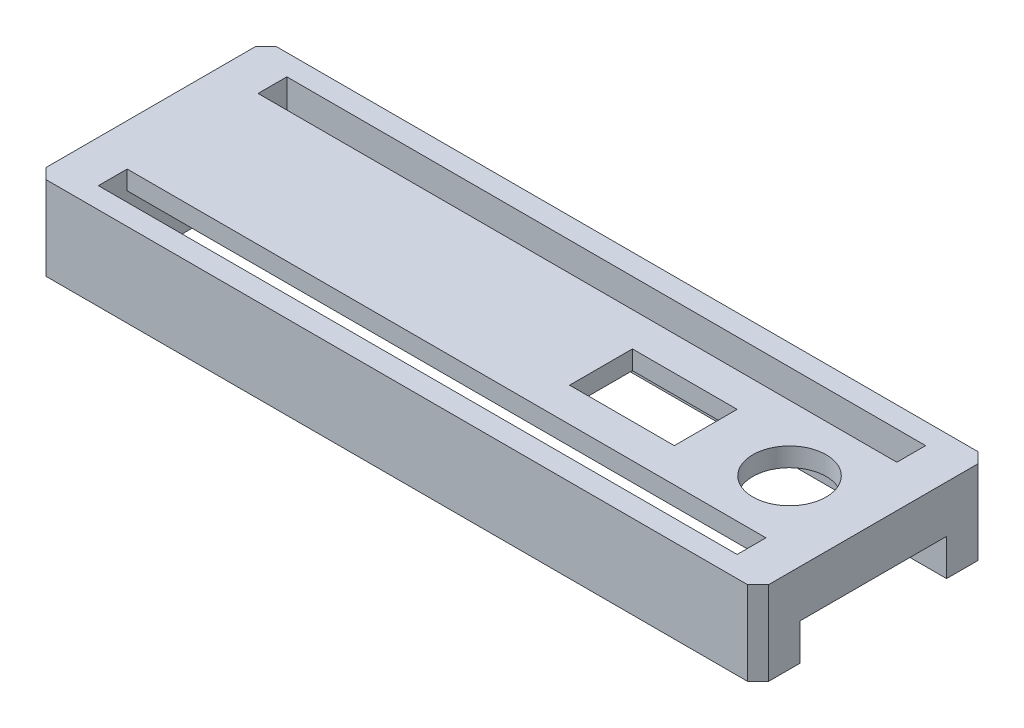
ISO-10303-21;
HEADER;
FILE_DESCRIPTION(('STEP AP214'),'2;1');
FILE_NAME('part.step','',(''),(''),'','','');
FILE_SCHEMA(('AUTOMOTIVE_DESIGN { 1 0 10303 214 1 1 1 1 }'));
ENDSEC;
DATA;
#1=APPLICATION_CONTEXT('core data for automotive mechanical design processes');
#2=APPLICATION_PROTOCOL_DEFINITION('international standard','automotive_design',2000,#1);
#3=PRODUCT_CONTEXT('',#1,'mechanical');
#4=PRODUCT('Part','Part','',(#3));
#5=PRODUCT_RELATED_PRODUCT_CATEGORY('part','',(#4));
#6=PRODUCT_DEFINITION_FORMATION('','',#4);
#7=PRODUCT_DEFINITION_CONTEXT('part definition',#1,'design');
#8=PRODUCT_DEFINITION('design','',#6,#7);
#9=PRODUCT_DEFINITION_SHAPE('','',#8);
#10=(LENGTH_UNIT() NAMED_UNIT(*) SI_UNIT(.MILLI.,.METRE.));
#11=(NAMED_UNIT(*) PLANE_ANGLE_UNIT() SI_UNIT($,.RADIAN.));
#12=(NAMED_UNIT(*) SI_UNIT($,.STERADIAN.) SOLID_ANGLE_UNIT());
#13=UNCERTAINTY_MEASURE_WITH_UNIT(LENGTH_MEASURE(1.E-05),#10,'distance_accuracy_value','');
#14=(GEOMETRIC_REPRESENTATION_CONTEXT(3) GLOBAL_UNCERTAINTY_ASSIGNED_CONTEXT((#13)) GLOBAL_UNIT_ASSIGNED_CONTEXT((#10,
#11,#12)) REPRESENTATION_CONTEXT('',''));
#15=CARTESIAN_POINT('',(0.,0.,0.));
#16=DIRECTION('',(0.,0.,1.));
#17=DIRECTION('',(1.,0.,0.));
#18=AXIS2_PLACEMENT_3D('',#15,#16,#17);
#19=CARTESIAN_POINT('',(0.,0.,0.));
#20=DIRECTION('',(0.,1.,0.));
#21=DIRECTION('',(0.,0.,1.));
#22=AXIS2_PLACEMENT_3D('',#19,#20,#21);
#23=PLANE('',#22);
#24=DIRECTION('',(-1.,0.,0.));
#25=VECTOR('',#24,1.);
#26=CARTESIAN_POINT('',(8.00000000000001,0.,-3.));
#27=LINE('',#26,#25);
#28=CARTESIAN_POINT('',(18.,0.,-3.));
#29=VERTEX_POINT('',#28);
#30=CARTESIAN_POINT('',(8.00000000000001,0.,-3.));
#31=VERTEX_POINT('',#30);
#32=EDGE_CURVE('E371',#29,#31,#27,.T.);
#33=ORIENTED_EDGE('',*,*,#32,.F.);
#34=DIRECTION('',(0.,0.,1.));
#35=VECTOR('',#34,1.);
#36=CARTESIAN_POINT('',(18.,0.,-3.));
#37=LINE('',#36,#35);
#38=CARTESIAN_POINT('',(18.,0.,-9.));
#39=VERTEX_POINT('',#38);
#40=EDGE_CURVE('E375',#39,#29,#37,.T.);
#41=ORIENTED_EDGE('',*,*,#40,.F.);
#42=DIRECTION('',(1.,0.,0.));
#43=VECTOR('',#42,1.);
#44=CARTESIAN_POINT('',(8.00000000000001,0.,-9.));
#45=LINE('',#44,#43);
#46=CARTESIAN_POINT('',(8.00000000000001,0.,-9.));
#47=VERTEX_POINT('',#46);
#48=EDGE_CURVE('E378',#47,#39,#45,.T.);
#49=ORIENTED_EDGE('',*,*,#48,.F.);
#50=DIRECTION('',(0.,0.,-1.));
#51=VECTOR('',#50,1.);
#52=CARTESIAN_POINT('',(8.00000000000001,0.,-3.));
#53=LINE('',#52,#51);
#54=EDGE_CURVE('E367',#31,#47,#53,.T.);
#55=ORIENTED_EDGE('',*,*,#54,.F.);
#56=EDGE_LOOP('',(#33,#41,#49,#55));
#57=FACE_BOUND('',#56,.T.);
#58=CARTESIAN_POINT('',(26.,0.,-6.));
#59=DIRECTION('',(0.,1.,0.));
#60=DIRECTION('',(0.,0.,1.));
#61=AXIS2_PLACEMENT_3D('',#58,#59,#60);
#62=CIRCLE('',#61,3.5);
#63=CARTESIAN_POINT('',(26.,0.,-2.5));
#64=VERTEX_POINT('',#63);
#65=EDGE_CURVE('E411',#64,#64,#62,.F.);
#66=ORIENTED_EDGE('',*,*,#65,.F.);
#67=EDGE_LOOP('',(#66));
#68=FACE_BOUND('',#67,.T.);
#69=DIRECTION('',(0.,0.,-1.));
#70=VECTOR('',#69,1.);
#71=CARTESIAN_POINT('',(30.,0.,0.));
#72=LINE('',#71,#70);
#73=CARTESIAN_POINT('',(30.,0.,0.25));
#74=VERTEX_POINT('',#73);
#75=CARTESIAN_POINT('',(30.,0.,-12.25));
#76=VERTEX_POINT('',#75);
#77=EDGE_CURVE('E298',#74,#76,#72,.T.);
#78=ORIENTED_EDGE('',*,*,#77,.F.);
#79=DIRECTION('',(-1.,0.,0.));
#80=VECTOR('',#79,1.);
#81=CARTESIAN_POINT('',(30.,0.,0.25));
#82=LINE('',#81,#80);
#83=CARTESIAN_POINT('',(-31.,0.,0.250000000000007));
#84=VERTEX_POINT('',#83);
#85=EDGE_CURVE('E444',#74,#84,#82,.T.);
#86=ORIENTED_EDGE('',*,*,#85,.T.);
#87=DIRECTION('',(0.,0.,-1.));
#88=VECTOR('',#87,1.);
#89=CARTESIAN_POINT('',(-31.,0.,0.));
#90=LINE('',#89,#88);
#91=CARTESIAN_POINT('',(-31.,0.,-12.25));
#92=VERTEX_POINT('',#91);
#93=EDGE_CURVE('E295',#84,#92,#90,.T.);
#94=ORIENTED_EDGE('',*,*,#93,.T.);
#95=DIRECTION('',(1.,0.,0.));
#96=VECTOR('',#95,1.);
#97=CARTESIAN_POINT('',(-31.,0.,-12.25));
#98=LINE('',#97,#96);
#99=EDGE_CURVE('E246',#92,#76,#98,.T.);
#100=ORIENTED_EDGE('',*,*,#99,.T.);
#101=EDGE_LOOP('',(#78,#86,#94,#100));
#102=FACE_BOUND('',#101,.T.);
#103=ADVANCED_FACE('F46',(#57,#68,#102),#23,.F.);
#104=CARTESIAN_POINT('',(-35.,1.8,-12.));
#105=DIRECTION('',(1.,0.,0.));
#106=DIRECTION('',(0.,0.,-1.));
#107=AXIS2_PLACEMENT_3D('',#104,#105,#106);
#108=PLANE('',#107);
#109=DIRECTION('',(0.,0.,1.));
#110=VECTOR('',#109,1.);
#111=CARTESIAN_POINT('',(-35.,1.8,-12.));
#112=LINE('',#111,#110);
#113=CARTESIAN_POINT('',(-35.,1.8,-16.));
#114=VERTEX_POINT('',#113);
#115=CARTESIAN_POINT('',(-35.,1.8,4.00000000000001));
#116=VERTEX_POINT('',#115);
#117=EDGE_CURVE('E288',#114,#116,#112,.T.);
#118=ORIENTED_EDGE('',*,*,#117,.F.);
#119=DIRECTION('',(0.,-1.,0.));
#120=VECTOR('',#119,1.);
#121=CARTESIAN_POINT('',(-35.,-6.2,-16.));
#122=LINE('',#121,#120);
#123=CARTESIAN_POINT('',(-35.,-6.2,-16.));
#124=VERTEX_POINT('',#123);
#125=EDGE_CURVE('E324',#114,#124,#122,.T.);
#126=ORIENTED_EDGE('',*,*,#125,.T.);
#127=DIRECTION('',(0.,0.,1.));
#128=VECTOR('',#127,1.);
#129=CARTESIAN_POINT('',(-35.,-6.2,-15.));
#130=LINE('',#129,#128);
#131=CARTESIAN_POINT('',(-35.,-6.2,4.00000000000001));
#132=VERTEX_POINT('',#131);
#133=EDGE_CURVE('E272',#124,#132,#130,.T.);
#134=ORIENTED_EDGE('',*,*,#133,.T.);
#135=DIRECTION('',(0.,1.,0.));
#136=VECTOR('',#135,1.);
#137=CARTESIAN_POINT('',(-35.,1.8,4.00000000000001));
#138=LINE('',#137,#136);
#139=EDGE_CURVE('E320',#132,#116,#138,.T.);
#140=ORIENTED_EDGE('',*,*,#139,.T.);
#141=EDGE_LOOP('',(#118,#126,#134,#140));
#142=FACE_BOUND('',#141,.T.);
#143=ADVANCED_FACE('F495',(#142),#108,.F.);
#144=CARTESIAN_POINT('',(0.,1.8,0.));
#145=DIRECTION('',(0.,1.,0.));
#146=DIRECTION('',(0.,0.,1.));
#147=AXIS2_PLACEMENT_3D('',#144,#145,#146);
#148=PLANE('',#147);
#149=DIRECTION('',(-1.,0.,0.));
#150=VECTOR('',#149,1.);
#151=CARTESIAN_POINT('',(35.,1.8,-17.));
#152=LINE('',#151,#150);
#153=CARTESIAN_POINT('',(33.,1.8,-17.));
#154=VERTEX_POINT('',#153);
#155=CARTESIAN_POINT('',(-34.,1.8,-17.));
#156=VERTEX_POINT('',#155);
#157=EDGE_CURVE('E434',#154,#156,#152,.T.);
#158=ORIENTED_EDGE('',*,*,#157,.T.);
#159=DIRECTION('',(-0.707106781186545,0.,0.70710678118655));
#160=VECTOR('',#159,1.);
#161=CARTESIAN_POINT('',(-25.5000000000001,1.8,-25.4999999999999));
#162=LINE('',#161,#160);
#163=EDGE_CURVE('E317',#156,#114,#162,.T.);
#164=ORIENTED_EDGE('',*,*,#163,.T.);
#165=ORIENTED_EDGE('',*,*,#117,.T.);
#166=DIRECTION('',(0.70710678118655,0.,0.707106781186545));
#167=VECTOR('',#166,1.);
#168=CARTESIAN_POINT('',(-19.4999999999999,1.8,19.5));
#169=LINE('',#168,#167);
#170=CARTESIAN_POINT('',(-34.,1.8,5.00000000000001));
#171=VERTEX_POINT('',#170);
#172=EDGE_CURVE('E314',#116,#171,#169,.T.);
#173=ORIENTED_EDGE('',*,*,#172,.T.);
#174=DIRECTION('',(1.,0.,0.));
#175=VECTOR('',#174,1.);
#176=CARTESIAN_POINT('',(35.,1.8,5.));
#177=LINE('',#176,#175);
#178=CARTESIAN_POINT('',(33.,1.8,5.));
#179=VERTEX_POINT('',#178);
#180=EDGE_CURVE('E423',#171,#179,#177,.T.);
#181=ORIENTED_EDGE('',*,*,#180,.T.);
#182=DIRECTION('',(0.707106781186542,0.,-0.707106781186553));
#183=VECTOR('',#182,1.);
#184=CARTESIAN_POINT('',(19.0000000000003,1.8,19.));
#185=LINE('',#184,#183);
#186=CARTESIAN_POINT('',(34.,1.8,4.));
#187=VERTEX_POINT('',#186);
#188=EDGE_CURVE('E311',#179,#187,#185,.T.);
#189=ORIENTED_EDGE('',*,*,#188,.T.);
#190=DIRECTION('',(0.,0.,1.));
#191=VECTOR('',#190,1.);
#192=CARTESIAN_POINT('',(34.,1.8,-17.));
#193=LINE('',#192,#191);
#194=CARTESIAN_POINT('',(34.,1.8,-16.));
#195=VERTEX_POINT('',#194);
#196=EDGE_CURVE('E348',#195,#187,#193,.T.);
#197=ORIENTED_EDGE('',*,*,#196,.F.);
#198=DIRECTION('',(-0.707106781186548,0.,-0.707106781186548));
#199=VECTOR('',#198,1.);
#200=CARTESIAN_POINT('',(25.,1.8,-25.));
#201=LINE('',#200,#199);
#202=EDGE_CURVE('E308',#195,#154,#201,.T.);
#203=ORIENTED_EDGE('',*,*,#202,.T.);
#204=EDGE_LOOP('',(#158,#164,#165,#173,#181,#189,#197,#203));
#205=FACE_BOUND('',#204,.T.);
#206=DIRECTION('',(0.,0.,-1.));
#207=VECTOR('',#206,1.);
#208=CARTESIAN_POINT('',(18.,1.8,-3.));
#209=LINE('',#208,#207);
#210=CARTESIAN_POINT('',(18.,1.8,-3.));
#211=VERTEX_POINT('',#210);
#212=CARTESIAN_POINT('',(18.,1.8,-9.));
#213=VERTEX_POINT('',#212);
#214=EDGE_CURVE('E228',#211,#213,#209,.T.);
#215=ORIENTED_EDGE('',*,*,#214,.F.);
#216=DIRECTION('',(1.,0.,0.));
#217=VECTOR('',#216,1.);
#218=CARTESIAN_POINT('',(8.00000000000001,1.8,-3.));
#219=LINE('',#218,#217);
#220=CARTESIAN_POINT('',(8.00000000000001,1.8,-3.));
#221=VERTEX_POINT('',#220);
#222=EDGE_CURVE('E389',#221,#211,#219,.T.);
#223=ORIENTED_EDGE('',*,*,#222,.F.);
#224=DIRECTION('',(0.,0.,1.));
#225=VECTOR('',#224,1.);
#226=CARTESIAN_POINT('',(8.00000000000001,1.8,-3.));
#227=LINE('',#226,#225);
#228=CARTESIAN_POINT('',(8.00000000000001,1.8,-9.));
#229=VERTEX_POINT('',#228);
#230=EDGE_CURVE('E385',#229,#221,#227,.T.);
#231=ORIENTED_EDGE('',*,*,#230,.F.);
#232=DIRECTION('',(-1.,0.,0.));
#233=VECTOR('',#232,1.);
#234=CARTESIAN_POINT('',(8.00000000000001,1.8,-9.));
#235=LINE('',#234,#233);
#236=EDGE_CURVE('E381',#213,#229,#235,.T.);
#237=ORIENTED_EDGE('',*,*,#236,.F.);
#238=EDGE_LOOP('',(#215,#223,#231,#237));
#239=FACE_BOUND('',#238,.T.);
#240=CARTESIAN_POINT('',(26.,1.8,-6.));
#241=DIRECTION('',(0.,1.,0.));
#242=DIRECTION('',(0.,0.,1.));
#243=AXIS2_PLACEMENT_3D('',#240,#241,#242);
#244=CIRCLE('',#243,3.5);
#245=CARTESIAN_POINT('',(26.,1.8,-2.5));
#246=VERTEX_POINT('',#245);
#247=EDGE_CURVE('E407',#246,#246,#244,.T.);
#248=ORIENTED_EDGE('',*,*,#247,.F.);
#249=EDGE_LOOP('',(#248));
#250=FACE_BOUND('',#249,.T.);
#251=DIRECTION('',(-1.,0.,0.));
#252=VECTOR('',#251,1.);
#253=CARTESIAN_POINT('',(-35.,1.8,3.));
#254=LINE('',#253,#252);
#255=CARTESIAN_POINT('',(30.,1.8,3.));
#256=VERTEX_POINT('',#255);
#257=CARTESIAN_POINT('',(-31.,1.8,3.));
#258=VERTEX_POINT('',#257);
#259=EDGE_CURVE('E419',#256,#258,#254,.T.);
#260=ORIENTED_EDGE('',*,*,#259,.T.);
#261=DIRECTION('',(0.,0.,-1.));
#262=VECTOR('',#261,1.);
#263=CARTESIAN_POINT('',(-31.,1.8,3.));
#264=LINE('',#263,#262);
#265=CARTESIAN_POINT('',(-31.,1.8,0.250000000000008));
#266=VERTEX_POINT('',#265);
#267=EDGE_CURVE('E277',#258,#266,#264,.T.);
#268=ORIENTED_EDGE('',*,*,#267,.T.);
#269=DIRECTION('',(1.,0.,0.));
#270=VECTOR('',#269,1.);
#271=CARTESIAN_POINT('',(30.,1.8,0.25));
#272=LINE('',#271,#270);
#273=CARTESIAN_POINT('',(30.,1.8,0.250000000000008));
#274=VERTEX_POINT('',#273);
#275=EDGE_CURVE('E455',#266,#274,#272,.T.);
#276=ORIENTED_EDGE('',*,*,#275,.T.);
#277=DIRECTION('',(0.,0.,-1.));
#278=VECTOR('',#277,1.);
#279=CARTESIAN_POINT('',(30.,1.8,3.));
#280=LINE('',#279,#278);
#281=EDGE_CURVE('E257',#256,#274,#280,.T.);
#282=ORIENTED_EDGE('',*,*,#281,.F.);
#283=EDGE_LOOP('',(#260,#268,#276,#282));
#284=FACE_BOUND('',#283,.T.);
#285=CARTESIAN_POINT('',(-31.,1.8,-12.25));
#286=VERTEX_POINT('',#285);
#287=CARTESIAN_POINT('',(-31.,1.8,-15.));
#288=VERTEX_POINT('',#287);
#289=EDGE_CURVE('E265',#286,#288,#264,.T.);
#290=ORIENTED_EDGE('',*,*,#289,.T.);
#291=DIRECTION('',(1.,0.,0.));
#292=VECTOR('',#291,1.);
#293=CARTESIAN_POINT('',(-35.,1.8,-15.));
#294=LINE('',#293,#292);
#295=CARTESIAN_POINT('',(30.,1.8,-15.));
#296=VERTEX_POINT('',#295);
#297=EDGE_CURVE('E426',#288,#296,#294,.T.);
#298=ORIENTED_EDGE('',*,*,#297,.T.);
#299=CARTESIAN_POINT('',(30.,1.8,-12.25));
#300=VERTEX_POINT('',#299);
#301=EDGE_CURVE('E253',#300,#296,#280,.T.);
#302=ORIENTED_EDGE('',*,*,#301,.F.);
#303=DIRECTION('',(-1.,0.,0.));
#304=VECTOR('',#303,1.);
#305=CARTESIAN_POINT('',(-31.,1.8,-12.25));
#306=LINE('',#305,#304);
#307=EDGE_CURVE('E443',#300,#286,#306,.T.);
#308=ORIENTED_EDGE('',*,*,#307,.T.);
#309=EDGE_LOOP('',(#290,#298,#302,#308));
#310=FACE_BOUND('',#309,.T.);
#311=ADVANCED_FACE('F354',(#205,#239,#250,#284,#310),#148,.T.);
#312=CARTESIAN_POINT('',(-31.,-6.2,3.));
#313=DIRECTION('',(1.,0.,0.));
#314=DIRECTION('',(0.,0.,-1.));
#315=AXIS2_PLACEMENT_3D('',#312,#313,#314);
#316=PLANE('',#315);
#317=DIRECTION('',(0.,1.,0.));
#318=VECTOR('',#317,1.);
#319=CARTESIAN_POINT('',(-31.,-62.2675678021874,-12.25));
#320=LINE('',#319,#318);
#321=EDGE_CURVE('E459',#92,#286,#320,.T.);
#322=ORIENTED_EDGE('',*,*,#321,.F.);
#323=ORIENTED_EDGE('',*,*,#93,.F.);
#324=DIRECTION('',(0.,1.,0.));
#325=VECTOR('',#324,1.);
#326=CARTESIAN_POINT('',(-31.,-62.2675678021874,0.250000000000008));
#327=LINE('',#326,#325);
#328=EDGE_CURVE('E466',#84,#266,#327,.T.);
#329=ORIENTED_EDGE('',*,*,#328,.T.);
#330=ORIENTED_EDGE('',*,*,#267,.F.);
#331=DIRECTION('',(0.,1.,0.));
#332=VECTOR('',#331,1.);
#333=CARTESIAN_POINT('',(-31.,-6.2,3.));
#334=LINE('',#333,#332);
#335=CARTESIAN_POINT('',(-31.,-6.2,3.));
#336=VERTEX_POINT('',#335);
#337=EDGE_CURVE('E280',#336,#258,#334,.T.);
#338=ORIENTED_EDGE('',*,*,#337,.F.);
#339=DIRECTION('',(0.,0.,-1.));
#340=VECTOR('',#339,1.);
#341=CARTESIAN_POINT('',(-31.,-6.2,3.));
#342=LINE('',#341,#340);
#343=CARTESIAN_POINT('',(-31.,-6.2,-15.));
#344=VERTEX_POINT('',#343);
#345=EDGE_CURVE('E276',#336,#344,#342,.T.);
#346=ORIENTED_EDGE('',*,*,#345,.T.);
#347=DIRECTION('',(0.,1.,0.));
#348=VECTOR('',#347,1.);
#349=CARTESIAN_POINT('',(-31.,-6.2,-15.));
#350=LINE('',#349,#348);
#351=EDGE_CURVE('E284',#344,#288,#350,.T.);
#352=ORIENTED_EDGE('',*,*,#351,.T.);
#353=ORIENTED_EDGE('',*,*,#289,.F.);
#354=EDGE_LOOP('',(#322,#323,#329,#330,#338,#346,#352,#353));
#355=FACE_BOUND('',#354,.T.);
#356=ADVANCED_FACE('F592',(#355),#316,.T.);
#357=CARTESIAN_POINT('',(0.,-6.2,0.));
#358=DIRECTION('',(0.,1.,0.));
#359=DIRECTION('',(0.,0.,1.));
#360=AXIS2_PLACEMENT_3D('',#357,#358,#359);
#361=PLANE('',#360);
#362=ORIENTED_EDGE('',*,*,#133,.F.);
#363=DIRECTION('',(0.707106781186545,0.,-0.70710678118655));
#364=VECTOR('',#363,1.);
#365=CARTESIAN_POINT('',(-34.,-6.2,-17.));
#366=LINE('',#365,#364);
#367=CARTESIAN_POINT('',(-34.,-6.2,-17.));
#368=VERTEX_POINT('',#367);
#369=EDGE_CURVE('E335',#124,#368,#366,.T.);
#370=ORIENTED_EDGE('',*,*,#369,.T.);
#371=DIRECTION('',(1.,0.,0.));
#372=VECTOR('',#371,1.);
#373=CARTESIAN_POINT('',(35.,-6.2,-17.));
#374=LINE('',#373,#372);
#375=CARTESIAN_POINT('',(33.,-6.2,-17.));
#376=VERTEX_POINT('',#375);
#377=EDGE_CURVE('E429',#368,#376,#374,.T.);
#378=ORIENTED_EDGE('',*,*,#377,.T.);
#379=DIRECTION('',(0.707106781186548,0.,0.707106781186548));
#380=VECTOR('',#379,1.);
#381=CARTESIAN_POINT('',(34.,-6.2,-16.));
#382=LINE('',#381,#380);
#383=CARTESIAN_POINT('',(34.,-6.2,-16.));
#384=VERTEX_POINT('',#383);
#385=EDGE_CURVE('E327',#376,#384,#382,.T.);
#386=ORIENTED_EDGE('',*,*,#385,.T.);
#387=DIRECTION('',(0.,0.,-1.));
#388=VECTOR('',#387,1.);
#389=CARTESIAN_POINT('',(34.,-6.2,-17.));
#390=LINE('',#389,#388);
#391=CARTESIAN_POINT('',(34.,-6.2,-13.));
#392=VERTEX_POINT('',#391);
#393=EDGE_CURVE('E218',#392,#384,#390,.T.);
#394=ORIENTED_EDGE('',*,*,#393,.F.);
#395=DIRECTION('',(1.,0.,0.));
#396=VECTOR('',#395,1.);
#397=CARTESIAN_POINT('',(35.,-6.2,-13.));
#398=LINE('',#397,#396);
#399=CARTESIAN_POINT('',(30.,-6.2,-13.));
#400=VERTEX_POINT('',#399);
#401=EDGE_CURVE('E238',#400,#392,#398,.T.);
#402=ORIENTED_EDGE('',*,*,#401,.F.);
#403=DIRECTION('',(0.,0.,1.));
#404=VECTOR('',#403,1.);
#405=CARTESIAN_POINT('',(30.,-6.2,3.));
#406=LINE('',#405,#404);
#407=CARTESIAN_POINT('',(30.,-6.2,-15.));
#408=VERTEX_POINT('',#407);
#409=EDGE_CURVE('E261',#408,#400,#406,.T.);
#410=ORIENTED_EDGE('',*,*,#409,.F.);
#411=DIRECTION('',(-1.,0.,0.));
#412=VECTOR('',#411,1.);
#413=CARTESIAN_POINT('',(-35.,-6.2,-15.));
#414=LINE('',#413,#412);
#415=EDGE_CURVE('E433',#408,#344,#414,.T.);
#416=ORIENTED_EDGE('',*,*,#415,.T.);
#417=ORIENTED_EDGE('',*,*,#345,.F.);
#418=DIRECTION('',(1.,0.,0.));
#419=VECTOR('',#418,1.);
#420=CARTESIAN_POINT('',(-35.,-6.2,3.));
#421=LINE('',#420,#419);
#422=CARTESIAN_POINT('',(30.,-6.2,3.));
#423=VERTEX_POINT('',#422);
#424=EDGE_CURVE('E418',#336,#423,#421,.T.);
#425=ORIENTED_EDGE('',*,*,#424,.T.);
#426=CARTESIAN_POINT('',(30.,-6.2,1.));
#427=VERTEX_POINT('',#426);
#428=EDGE_CURVE('E235',#427,#423,#406,.T.);
#429=ORIENTED_EDGE('',*,*,#428,.F.);
#430=DIRECTION('',(-1.,0.,0.));
#431=VECTOR('',#430,1.);
#432=CARTESIAN_POINT('',(30.,-6.2,1.));
#433=LINE('',#432,#431);
#434=CARTESIAN_POINT('',(34.,-6.2,1.));
#435=VERTEX_POINT('',#434);
#436=EDGE_CURVE('E224',#435,#427,#433,.T.);
#437=ORIENTED_EDGE('',*,*,#436,.F.);
#438=CARTESIAN_POINT('',(34.,-6.2,4.));
#439=VERTEX_POINT('',#438);
#440=EDGE_CURVE('E208',#439,#435,#390,.T.);
#441=ORIENTED_EDGE('',*,*,#440,.F.);
#442=DIRECTION('',(-0.707106781186542,0.,0.707106781186553));
#443=VECTOR('',#442,1.);
#444=CARTESIAN_POINT('',(33.,-6.2,5.));
#445=LINE('',#444,#443);
#446=CARTESIAN_POINT('',(33.,-6.2,5.));
#447=VERTEX_POINT('',#446);
#448=EDGE_CURVE('E70',#439,#447,#445,.T.);
#449=ORIENTED_EDGE('',*,*,#448,.T.);
#450=DIRECTION('',(-1.,0.,0.));
#451=VECTOR('',#450,1.);
#452=CARTESIAN_POINT('',(35.,-6.2,5.));
#453=LINE('',#452,#451);
#454=CARTESIAN_POINT('',(-34.,-6.2,5.00000000000001));
#455=VERTEX_POINT('',#454);
#456=EDGE_CURVE('E415',#447,#455,#453,.T.);
#457=ORIENTED_EDGE('',*,*,#456,.T.);
#458=DIRECTION('',(-0.70710678118655,0.,-0.707106781186545));
#459=VECTOR('',#458,1.);
#460=CARTESIAN_POINT('',(-35.,-6.2,4.00000000000001));
#461=LINE('',#460,#459);
#462=EDGE_CURVE('E332',#455,#132,#461,.T.);
#463=ORIENTED_EDGE('',*,*,#462,.T.);
#464=EDGE_LOOP('',(#362,#370,#378,#386,#394,#402,#410,#416,#417,#425,#429,#437,#441,#449,#457,#463));
#465=FACE_BOUND('',#464,.T.);
#466=ADVANCED_FACE('F233',(#465),#361,.F.);
#467=CARTESIAN_POINT('',(30.,-24.8815416922694,3.));
#468=DIRECTION('',(1.,0.,0.));
#469=DIRECTION('',(0.,0.,-1.));
#470=AXIS2_PLACEMENT_3D('',#467,#468,#469);
#471=PLANE('',#470);
#472=ORIENTED_EDGE('',*,*,#77,.T.);
#473=DIRECTION('',(0.,1.,0.));
#474=VECTOR('',#473,1.);
#475=CARTESIAN_POINT('',(30.,-62.2675678021874,-12.25));
#476=LINE('',#475,#474);
#477=EDGE_CURVE('E448',#76,#300,#476,.T.);
#478=ORIENTED_EDGE('',*,*,#477,.T.);
#479=ORIENTED_EDGE('',*,*,#301,.T.);
#480=DIRECTION('',(0.,1.,0.));
#481=VECTOR('',#480,1.);
#482=CARTESIAN_POINT('',(30.,-24.8815416922694,-15.));
#483=LINE('',#482,#481);
#484=EDGE_CURVE('E268',#408,#296,#483,.T.);
#485=ORIENTED_EDGE('',*,*,#484,.F.);
#486=ORIENTED_EDGE('',*,*,#409,.T.);
#487=DIRECTION('',(0.,-1.,0.));
#488=VECTOR('',#487,1.);
#489=CARTESIAN_POINT('',(30.,-2.7,-13.));
#490=LINE('',#489,#488);
#491=CARTESIAN_POINT('',(30.,-2.7,-13.));
#492=VERTEX_POINT('',#491);
#493=EDGE_CURVE('E254',#492,#400,#490,.T.);
#494=ORIENTED_EDGE('',*,*,#493,.F.);
#495=DIRECTION('',(0.,0.,-1.));
#496=VECTOR('',#495,1.);
#497=CARTESIAN_POINT('',(30.,-2.7,-13.));
#498=LINE('',#497,#496);
#499=CARTESIAN_POINT('',(30.,-2.7,1.));
#500=VERTEX_POINT('',#499);
#501=EDGE_CURVE('E237',#500,#492,#498,.T.);
#502=ORIENTED_EDGE('',*,*,#501,.F.);
#503=DIRECTION('',(0.,-1.,0.));
#504=VECTOR('',#503,1.);
#505=CARTESIAN_POINT('',(30.,-2.7,1.));
#506=LINE('',#505,#504);
#507=EDGE_CURVE('E250',#500,#427,#506,.T.);
#508=ORIENTED_EDGE('',*,*,#507,.T.);
#509=ORIENTED_EDGE('',*,*,#428,.T.);
#510=DIRECTION('',(0.,1.,0.));
#511=VECTOR('',#510,1.);
#512=CARTESIAN_POINT('',(30.,-24.8815416922694,3.));
#513=LINE('',#512,#511);
#514=EDGE_CURVE('E260',#423,#256,#513,.T.);
#515=ORIENTED_EDGE('',*,*,#514,.T.);
#516=ORIENTED_EDGE('',*,*,#281,.T.);
#517=DIRECTION('',(0.,1.,0.));
#518=VECTOR('',#517,1.);
#519=CARTESIAN_POINT('',(30.,-62.2675678021874,0.25));
#520=LINE('',#519,#518);
#521=EDGE_CURVE('E462',#74,#274,#520,.T.);
#522=ORIENTED_EDGE('',*,*,#521,.F.);
#523=EDGE_LOOP('',(#472,#478,#479,#485,#486,#494,#502,#508,#509,#515,#516,#522));
#524=FACE_BOUND('',#523,.T.);
#525=ADVANCED_FACE('F480',(#524),#471,.F.);
#526=CARTESIAN_POINT('',(30.,-2.7,1.));
#527=DIRECTION('',(0.,0.,1.));
#528=DIRECTION('',(1.,0.,0.));
#529=AXIS2_PLACEMENT_3D('',#526,#527,#528);
#530=PLANE('',#529);
#531=DIRECTION('',(-1.,0.,0.));
#532=VECTOR('',#531,1.);
#533=CARTESIAN_POINT('',(30.,-2.7,1.));
#534=LINE('',#533,#532);
#535=CARTESIAN_POINT('',(34.,-2.7,1.));
#536=VERTEX_POINT('',#535);
#537=EDGE_CURVE('E226',#536,#500,#534,.T.);
#538=ORIENTED_EDGE('',*,*,#537,.F.);
#539=DIRECTION('',(0.,-1.,0.));
#540=VECTOR('',#539,1.);
#541=CARTESIAN_POINT('',(34.,-2.7,1.));
#542=LINE('',#541,#540);
#543=EDGE_CURVE('E212',#536,#435,#542,.T.);
#544=ORIENTED_EDGE('',*,*,#543,.T.);
#545=ORIENTED_EDGE('',*,*,#436,.T.);
#546=ORIENTED_EDGE('',*,*,#507,.F.);
#547=EDGE_LOOP('',(#538,#544,#545,#546));
#548=FACE_BOUND('',#547,.T.);
#549=ADVANCED_FACE('F222',(#548),#530,.F.);
#550=CARTESIAN_POINT('',(35.,-2.7,-13.));
#551=DIRECTION('',(0.,0.,-1.));
#552=DIRECTION('',(-1.,0.,0.));
#553=AXIS2_PLACEMENT_3D('',#550,#551,#552);
#554=PLANE('',#553);
#555=ORIENTED_EDGE('',*,*,#401,.T.);
#556=DIRECTION('',(0.,1.,0.));
#557=VECTOR('',#556,1.);
#558=CARTESIAN_POINT('',(34.,-2.7,-13.));
#559=LINE('',#558,#557);
#560=CARTESIAN_POINT('',(34.,-2.7,-13.));
#561=VERTEX_POINT('',#560);
#562=EDGE_CURVE('E229',#392,#561,#559,.T.);
#563=ORIENTED_EDGE('',*,*,#562,.T.);
#564=DIRECTION('',(1.,0.,0.));
#565=VECTOR('',#564,1.);
#566=CARTESIAN_POINT('',(35.,-2.7,-13.));
#567=LINE('',#566,#565);
#568=EDGE_CURVE('E243',#492,#561,#567,.T.);
#569=ORIENTED_EDGE('',*,*,#568,.F.);
#570=ORIENTED_EDGE('',*,*,#493,.T.);
#571=EDGE_LOOP('',(#555,#563,#569,#570));
#572=FACE_BOUND('',#571,.T.);
#573=ADVANCED_FACE('F484',(#572),#554,.F.);
#574=CARTESIAN_POINT('',(0.,-2.7,0.));
#575=DIRECTION('',(0.,1.,0.));
#576=DIRECTION('',(0.,0.,1.));
#577=AXIS2_PLACEMENT_3D('',#574,#575,#576);
#578=PLANE('',#577);
#579=ORIENTED_EDGE('',*,*,#568,.T.);
#580=DIRECTION('',(0.,0.,1.));
#581=VECTOR('',#580,1.);
#582=CARTESIAN_POINT('',(34.,-2.7,0.));
#583=LINE('',#582,#581);
#584=EDGE_CURVE('E217',#561,#536,#583,.T.);
#585=ORIENTED_EDGE('',*,*,#584,.T.);
#586=ORIENTED_EDGE('',*,*,#537,.T.);
#587=ORIENTED_EDGE('',*,*,#501,.T.);
#588=EDGE_LOOP('',(#579,#585,#586,#587));
#589=FACE_BOUND('',#588,.T.);
#590=ADVANCED_FACE('F476',(#589),#578,.F.);
#591=CARTESIAN_POINT('',(30.,-62.2675678021874,0.25));
#592=DIRECTION('',(0.,0.,1.));
#593=DIRECTION('',(1.,0.,0.));
#594=AXIS2_PLACEMENT_3D('',#591,#592,#593);
#595=PLANE('',#594);
#596=ORIENTED_EDGE('',*,*,#85,.F.);
#597=ORIENTED_EDGE('',*,*,#521,.T.);
#598=ORIENTED_EDGE('',*,*,#275,.F.);
#599=ORIENTED_EDGE('',*,*,#328,.F.);
#600=EDGE_LOOP('',(#596,#597,#598,#599));
#601=FACE_BOUND('',#600,.T.);
#602=ADVANCED_FACE('F576',(#601),#595,.T.);
#603=CARTESIAN_POINT('',(-31.,-62.2675678021874,-12.25));
#604=DIRECTION('',(0.,0.,-1.));
#605=DIRECTION('',(-1.,0.,0.));
#606=AXIS2_PLACEMENT_3D('',#603,#604,#605);
#607=PLANE('',#606);
#608=ORIENTED_EDGE('',*,*,#99,.F.);
#609=ORIENTED_EDGE('',*,*,#321,.T.);
#610=ORIENTED_EDGE('',*,*,#307,.F.);
#611=ORIENTED_EDGE('',*,*,#477,.F.);
#612=EDGE_LOOP('',(#608,#609,#610,#611));
#613=FACE_BOUND('',#612,.T.);
#614=ADVANCED_FACE('F574',(#613),#607,.T.);
#615=CARTESIAN_POINT('',(-35.,-76.2285656000464,-15.));
#616=DIRECTION('',(0.,0.,1.));
#617=DIRECTION('',(1.,0.,0.));
#618=AXIS2_PLACEMENT_3D('',#615,#616,#617);
#619=PLANE('',#618);
#620=ORIENTED_EDGE('',*,*,#297,.F.);
#621=ORIENTED_EDGE('',*,*,#351,.F.);
#622=ORIENTED_EDGE('',*,*,#415,.F.);
#623=ORIENTED_EDGE('',*,*,#484,.T.);
#624=EDGE_LOOP('',(#620,#621,#622,#623));
#625=FACE_BOUND('',#624,.T.);
#626=ADVANCED_FACE('F571',(#625),#619,.T.);
#627=CARTESIAN_POINT('',(35.,-76.2285656000464,-17.));
#628=DIRECTION('',(0.,0.,-1.));
#629=DIRECTION('',(-1.,0.,0.));
#630=AXIS2_PLACEMENT_3D('',#627,#628,#629);
#631=PLANE('',#630);
#632=ORIENTED_EDGE('',*,*,#377,.F.);
#633=DIRECTION('',(0.,1.,0.));
#634=VECTOR('',#633,1.);
#635=CARTESIAN_POINT('',(-34.,1.8,-17.));
#636=LINE('',#635,#634);
#637=EDGE_CURVE('E304',#368,#156,#636,.T.);
#638=ORIENTED_EDGE('',*,*,#637,.T.);
#639=ORIENTED_EDGE('',*,*,#157,.F.);
#640=DIRECTION('',(0.,-1.,0.));
#641=VECTOR('',#640,1.);
#642=CARTESIAN_POINT('',(33.,-6.2,-17.));
#643=LINE('',#642,#641);
#644=EDGE_CURVE('E301',#154,#376,#643,.T.);
#645=ORIENTED_EDGE('',*,*,#644,.T.);
#646=EDGE_LOOP('',(#632,#638,#639,#645));
#647=FACE_BOUND('',#646,.T.);
#648=ADVANCED_FACE('F489',(#647),#631,.T.);
#649=CARTESIAN_POINT('',(-35.,-76.2285656000464,3.));
#650=DIRECTION('',(0.,0.,-1.));
#651=DIRECTION('',(-1.,0.,0.));
#652=AXIS2_PLACEMENT_3D('',#649,#650,#651);
#653=PLANE('',#652);
#654=ORIENTED_EDGE('',*,*,#424,.F.);
#655=ORIENTED_EDGE('',*,*,#337,.T.);
#656=ORIENTED_EDGE('',*,*,#259,.F.);
#657=ORIENTED_EDGE('',*,*,#514,.F.);
#658=EDGE_LOOP('',(#654,#655,#656,#657));
#659=FACE_BOUND('',#658,.T.);
#660=ADVANCED_FACE('F565',(#659),#653,.T.);
#661=CARTESIAN_POINT('',(35.,-76.2285656000464,5.));
#662=DIRECTION('',(0.,0.,1.));
#663=DIRECTION('',(1.,0.,0.));
#664=AXIS2_PLACEMENT_3D('',#661,#662,#663);
#665=PLANE('',#664);
#666=ORIENTED_EDGE('',*,*,#180,.F.);
#667=DIRECTION('',(0.,-1.,0.));
#668=VECTOR('',#667,1.);
#669=CARTESIAN_POINT('',(-34.,-6.2,5.00000000000001));
#670=LINE('',#669,#668);
#671=EDGE_CURVE('E63',#171,#455,#670,.T.);
#672=ORIENTED_EDGE('',*,*,#671,.T.);
#673=ORIENTED_EDGE('',*,*,#456,.F.);
#674=DIRECTION('',(0.,1.,0.));
#675=VECTOR('',#674,1.);
#676=CARTESIAN_POINT('',(33.,1.8,5.));
#677=LINE('',#676,#675);
#678=EDGE_CURVE('E338',#447,#179,#677,.T.);
#679=ORIENTED_EDGE('',*,*,#678,.T.);
#680=EDGE_LOOP('',(#666,#672,#673,#679));
#681=FACE_BOUND('',#680,.T.);
#682=ADVANCED_FACE('F502',(#681),#665,.T.);
#683=CARTESIAN_POINT('',(26.,-9.89949493661167,-6.));
#684=DIRECTION('',(0.,1.,0.));
#685=DIRECTION('',(0.,0.,1.));
#686=AXIS2_PLACEMENT_3D('',#683,#684,#685);
#687=CYLINDRICAL_SURFACE('',#686,3.5);
#688=ORIENTED_EDGE('',*,*,#65,.T.);
#689=EDGE_LOOP('',(#688));
#690=FACE_BOUND('',#689,.T.);
#691=ORIENTED_EDGE('',*,*,#247,.T.);
#692=EDGE_LOOP('',(#691));
#693=FACE_BOUND('',#692,.T.);
#694=ADVANCED_FACE('F558',(#690,#693),#687,.F.);
#695=CARTESIAN_POINT('',(18.,-11.6619037896906,-3.));
#696=DIRECTION('',(1.,0.,0.));
#697=DIRECTION('',(0.,0.,-1.));
#698=AXIS2_PLACEMENT_3D('',#695,#696,#697);
#699=PLANE('',#698);
#700=ORIENTED_EDGE('',*,*,#40,.T.);
#701=DIRECTION('',(0.,1.,0.));
#702=VECTOR('',#701,1.);
#703=CARTESIAN_POINT('',(18.,-11.6619037896906,-3.));
#704=LINE('',#703,#702);
#705=EDGE_CURVE('E372',#29,#211,#704,.T.);
#706=ORIENTED_EDGE('',*,*,#705,.T.);
#707=ORIENTED_EDGE('',*,*,#214,.T.);
#708=DIRECTION('',(0.,1.,0.));
#709=VECTOR('',#708,1.);
#710=CARTESIAN_POINT('',(18.,-11.6619037896906,-9.));
#711=LINE('',#710,#709);
#712=EDGE_CURVE('E393',#39,#213,#711,.T.);
#713=ORIENTED_EDGE('',*,*,#712,.F.);
#714=EDGE_LOOP('',(#700,#706,#707,#713));
#715=FACE_BOUND('',#714,.T.);
#716=ADVANCED_FACE('F551',(#715),#699,.F.);
#717=CARTESIAN_POINT('',(8.00000000000001,-11.6619037896906,-3.));
#718=DIRECTION('',(0.,0.,1.));
#719=DIRECTION('',(1.,0.,0.));
#720=AXIS2_PLACEMENT_3D('',#717,#718,#719);
#721=PLANE('',#720);
#722=ORIENTED_EDGE('',*,*,#32,.T.);
#723=DIRECTION('',(0.,1.,0.));
#724=VECTOR('',#723,1.);
#725=CARTESIAN_POINT('',(8.00000000000001,-11.6619037896906,-3.));
#726=LINE('',#725,#724);
#727=EDGE_CURVE('E396',#31,#221,#726,.T.);
#728=ORIENTED_EDGE('',*,*,#727,.T.);
#729=ORIENTED_EDGE('',*,*,#222,.T.);
#730=ORIENTED_EDGE('',*,*,#705,.F.);
#731=EDGE_LOOP('',(#722,#728,#729,#730));
#732=FACE_BOUND('',#731,.T.);
#733=ADVANCED_FACE('F548',(#732),#721,.F.);
#734=CARTESIAN_POINT('',(8.00000000000001,-11.6619037896906,-3.));
#735=DIRECTION('',(-1.,0.,0.));
#736=DIRECTION('',(0.,0.,1.));
#737=AXIS2_PLACEMENT_3D('',#734,#735,#736);
#738=PLANE('',#737);
#739=ORIENTED_EDGE('',*,*,#54,.T.);
#740=DIRECTION('',(0.,1.,0.));
#741=VECTOR('',#740,1.);
#742=CARTESIAN_POINT('',(8.00000000000001,-11.6619037896906,-9.));
#743=LINE('',#742,#741);
#744=EDGE_CURVE('E399',#47,#229,#743,.T.);
#745=ORIENTED_EDGE('',*,*,#744,.T.);
#746=ORIENTED_EDGE('',*,*,#230,.T.);
#747=ORIENTED_EDGE('',*,*,#727,.F.);
#748=EDGE_LOOP('',(#739,#745,#746,#747));
#749=FACE_BOUND('',#748,.T.);
#750=ADVANCED_FACE('F544',(#749),#738,.F.);
#751=CARTESIAN_POINT('',(8.00000000000001,-11.6619037896906,-9.));
#752=DIRECTION('',(0.,0.,-1.));
#753=DIRECTION('',(-1.,0.,0.));
#754=AXIS2_PLACEMENT_3D('',#751,#752,#753);
#755=PLANE('',#754);
#756=ORIENTED_EDGE('',*,*,#48,.T.);
#757=ORIENTED_EDGE('',*,*,#712,.T.);
#758=ORIENTED_EDGE('',*,*,#236,.T.);
#759=ORIENTED_EDGE('',*,*,#744,.F.);
#760=EDGE_LOOP('',(#756,#757,#758,#759));
#761=FACE_BOUND('',#760,.T.);
#762=ADVANCED_FACE('F539',(#761),#755,.F.);
#763=CARTESIAN_POINT('',(34.,-28.2227155455452,-17.));
#764=DIRECTION('',(-1.,0.,0.));
#765=DIRECTION('',(0.,0.,1.));
#766=AXIS2_PLACEMENT_3D('',#763,#764,#765);
#767=PLANE('',#766);
#768=ORIENTED_EDGE('',*,*,#196,.T.);
#769=DIRECTION('',(0.,-1.,0.));
#770=VECTOR('',#769,1.);
#771=CARTESIAN_POINT('',(34.,-6.2,4.));
#772=LINE('',#771,#770);
#773=EDGE_CURVE('E11',#187,#439,#772,.T.);
#774=ORIENTED_EDGE('',*,*,#773,.T.);
#775=ORIENTED_EDGE('',*,*,#440,.T.);
#776=ORIENTED_EDGE('',*,*,#543,.F.);
#777=ORIENTED_EDGE('',*,*,#584,.F.);
#778=ORIENTED_EDGE('',*,*,#562,.F.);
#779=ORIENTED_EDGE('',*,*,#393,.T.);
#780=DIRECTION('',(0.,1.,0.));
#781=VECTOR('',#780,1.);
#782=CARTESIAN_POINT('',(34.,1.8,-16.));
#783=LINE('',#782,#781);
#784=EDGE_CURVE('E56',#384,#195,#783,.T.);
#785=ORIENTED_EDGE('',*,*,#784,.T.);
#786=EDGE_LOOP('',(#768,#774,#775,#776,#777,#778,#779,#785));
#787=FACE_BOUND('',#786,.T.);
#788=ADVANCED_FACE('F211',(#787),#767,.F.);
#789=CARTESIAN_POINT('',(-34.,-76.2285656000464,-17.));
#790=DIRECTION('',(-0.70710678118655,0.,-0.707106781186545));
#791=DIRECTION('',(0.,-1.,0.));
#792=AXIS2_PLACEMENT_3D('',#789,#790,#791);
#793=PLANE('',#792);
#794=ORIENTED_EDGE('',*,*,#369,.F.);
#795=ORIENTED_EDGE('',*,*,#125,.F.);
#796=ORIENTED_EDGE('',*,*,#163,.F.);
#797=ORIENTED_EDGE('',*,*,#637,.F.);
#798=EDGE_LOOP('',(#794,#795,#796,#797));
#799=FACE_BOUND('',#798,.T.);
#800=ADVANCED_FACE('F498',(#799),#793,.T.);
#801=CARTESIAN_POINT('',(-35.,1.8,4.00000000000001));
#802=DIRECTION('',(-0.707106781186545,0.,0.70710678118655));
#803=DIRECTION('',(0.,-1.,0.));
#804=AXIS2_PLACEMENT_3D('',#801,#802,#803);
#805=PLANE('',#804);
#806=ORIENTED_EDGE('',*,*,#462,.F.);
#807=ORIENTED_EDGE('',*,*,#671,.F.);
#808=ORIENTED_EDGE('',*,*,#172,.F.);
#809=ORIENTED_EDGE('',*,*,#139,.F.);
#810=EDGE_LOOP('',(#806,#807,#808,#809));
#811=FACE_BOUND('',#810,.T.);
#812=ADVANCED_FACE('F501',(#811),#805,.T.);
#813=CARTESIAN_POINT('',(33.,-76.2285656000464,5.));
#814=DIRECTION('',(0.707106781186553,0.,0.707106781186542));
#815=DIRECTION('',(0.,-1.,0.));
#816=AXIS2_PLACEMENT_3D('',#813,#814,#815);
#817=PLANE('',#816);
#818=ORIENTED_EDGE('',*,*,#448,.F.);
#819=ORIENTED_EDGE('',*,*,#773,.F.);
#820=ORIENTED_EDGE('',*,*,#188,.F.);
#821=ORIENTED_EDGE('',*,*,#678,.F.);
#822=EDGE_LOOP('',(#818,#819,#820,#821));
#823=FACE_BOUND('',#822,.T.);
#824=ADVANCED_FACE('F505',(#823),#817,.T.);
#825=CARTESIAN_POINT('',(34.,-28.2227155455452,-16.));
#826=DIRECTION('',(0.707106781186547,0.,-0.707106781186547));
#827=DIRECTION('',(0.,-1.,0.));
#828=AXIS2_PLACEMENT_3D('',#825,#826,#827);
#829=PLANE('',#828);
#830=ORIENTED_EDGE('',*,*,#385,.F.);
#831=ORIENTED_EDGE('',*,*,#644,.F.);
#832=ORIENTED_EDGE('',*,*,#202,.F.);
#833=ORIENTED_EDGE('',*,*,#784,.F.);
#834=EDGE_LOOP('',(#830,#831,#832,#833));
#835=FACE_BOUND('',#834,.T.);
#836=ADVANCED_FACE('F49',(#835),#829,.T.);
#837=CLOSED_SHELL('',(#103,#143,#311,#356,#466,#525,#549,#573,#590,#602,#614,#626,#648,#660,
#682,#694,#716,#733,#750,#762,#788,#800,#812,#824,#836));
#838=MANIFOLD_SOLID_BREP('B2',#837);
#839=ADVANCED_BREP_SHAPE_REPRESENTATION('',(#18,#838),#14);
#840=SHAPE_DEFINITION_REPRESENTATION(#9,#839);
ENDSEC;
END-ISO-10303-21;
